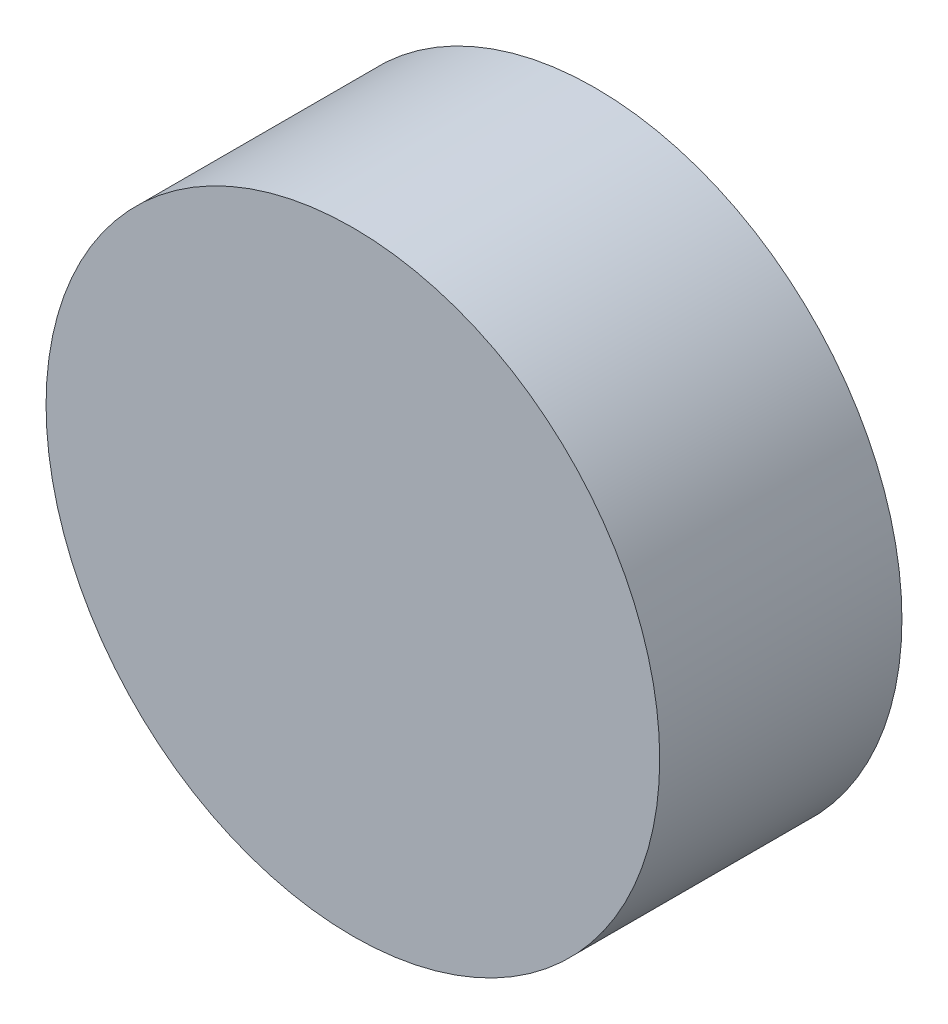
ISO-10303-21;
HEADER;
FILE_DESCRIPTION(('STEP AP214'),'2;1');
FILE_NAME('part.step','',(''),(''),'','','');
FILE_SCHEMA(('AUTOMOTIVE_DESIGN { 1 0 10303 214 1 1 1 1 }'));
ENDSEC;
DATA;
#1=APPLICATION_CONTEXT('core data for automotive mechanical design processes');
#2=APPLICATION_PROTOCOL_DEFINITION('international standard','automotive_design',2000,#1);
#3=PRODUCT_CONTEXT('',#1,'mechanical');
#4=PRODUCT('Part','Part','',(#3));
#5=PRODUCT_RELATED_PRODUCT_CATEGORY('part','',(#4));
#6=PRODUCT_DEFINITION_FORMATION('','',#4);
#7=PRODUCT_DEFINITION_CONTEXT('part definition',#1,'design');
#8=PRODUCT_DEFINITION('design','',#6,#7);
#9=PRODUCT_DEFINITION_SHAPE('','',#8);
#10=(LENGTH_UNIT() NAMED_UNIT(*) SI_UNIT(.MILLI.,.METRE.));
#11=(NAMED_UNIT(*) PLANE_ANGLE_UNIT() SI_UNIT($,.RADIAN.));
#12=(NAMED_UNIT(*) SI_UNIT($,.STERADIAN.) SOLID_ANGLE_UNIT());
#13=UNCERTAINTY_MEASURE_WITH_UNIT(LENGTH_MEASURE(1.E-05),#10,'distance_accuracy_value','');
#14=(GEOMETRIC_REPRESENTATION_CONTEXT(3) GLOBAL_UNCERTAINTY_ASSIGNED_CONTEXT((#13)) GLOBAL_UNIT_ASSIGNED_CONTEXT((#10,
#11,#12)) REPRESENTATION_CONTEXT('',''));
#15=CARTESIAN_POINT('',(0.,0.,0.));
#16=DIRECTION('',(0.,0.,1.));
#17=DIRECTION('',(1.,0.,0.));
#18=AXIS2_PLACEMENT_3D('',#15,#16,#17);
#19=CARTESIAN_POINT('',(0.,0.,3.));
#20=DIRECTION('',(0.,0.,-1.));
#21=DIRECTION('',(-1.,0.,0.));
#22=AXIS2_PLACEMENT_3D('',#19,#20,#21);
#23=CYLINDRICAL_SURFACE('',#22,3.8);
#24=CARTESIAN_POINT('',(0.,0.,3.));
#25=DIRECTION('',(0.,0.,1.));
#26=DIRECTION('',(1.,0.,0.));
#27=AXIS2_PLACEMENT_3D('',#24,#25,#26);
#28=CIRCLE('',#27,3.8);
#29=CARTESIAN_POINT('',(3.8,0.,3.));
#30=VERTEX_POINT('',#29);
#31=EDGE_CURVE('E10',#30,#30,#28,.T.);
#32=ORIENTED_EDGE('',*,*,#31,.F.);
#33=EDGE_LOOP('',(#32));
#34=FACE_BOUND('',#33,.T.);
#35=CARTESIAN_POINT('',(0.,0.,0.));
#36=DIRECTION('',(0.,0.,1.));
#37=DIRECTION('',(1.,0.,0.));
#38=AXIS2_PLACEMENT_3D('',#35,#36,#37);
#39=CIRCLE('',#38,3.8);
#40=CARTESIAN_POINT('',(3.8,0.,0.));
#41=VERTEX_POINT('',#40);
#42=EDGE_CURVE('E46',#41,#41,#39,.T.);
#43=ORIENTED_EDGE('',*,*,#42,.T.);
#44=EDGE_LOOP('',(#43));
#45=FACE_BOUND('',#44,.T.);
#46=ADVANCED_FACE('F43',(#34,#45),#23,.T.);
#47=CARTESIAN_POINT('',(0.,0.,3.));
#48=DIRECTION('',(0.,0.,1.));
#49=DIRECTION('',(1.,0.,0.));
#50=AXIS2_PLACEMENT_3D('',#47,#48,#49);
#51=PLANE('',#50);
#52=ORIENTED_EDGE('',*,*,#31,.T.);
#53=EDGE_LOOP('',(#52));
#54=FACE_BOUND('',#53,.T.);
#55=ADVANCED_FACE('F60',(#54),#51,.T.);
#56=CARTESIAN_POINT('',(0.,0.,0.));
#57=DIRECTION('',(0.,0.,1.));
#58=DIRECTION('',(1.,0.,0.));
#59=AXIS2_PLACEMENT_3D('',#56,#57,#58);
#60=PLANE('',#59);
#61=ORIENTED_EDGE('',*,*,#42,.F.);
#62=EDGE_LOOP('',(#61));
#63=FACE_BOUND('',#62,.T.);
#64=ADVANCED_FACE('F58',(#63),#60,.F.);
#65=CLOSED_SHELL('',(#46,#55,#64));
#66=MANIFOLD_SOLID_BREP('B2',#65);
#67=ADVANCED_BREP_SHAPE_REPRESENTATION('',(#18,#66),#14);
#68=SHAPE_DEFINITION_REPRESENTATION(#9,#67);
ENDSEC;
END-ISO-10303-21;
